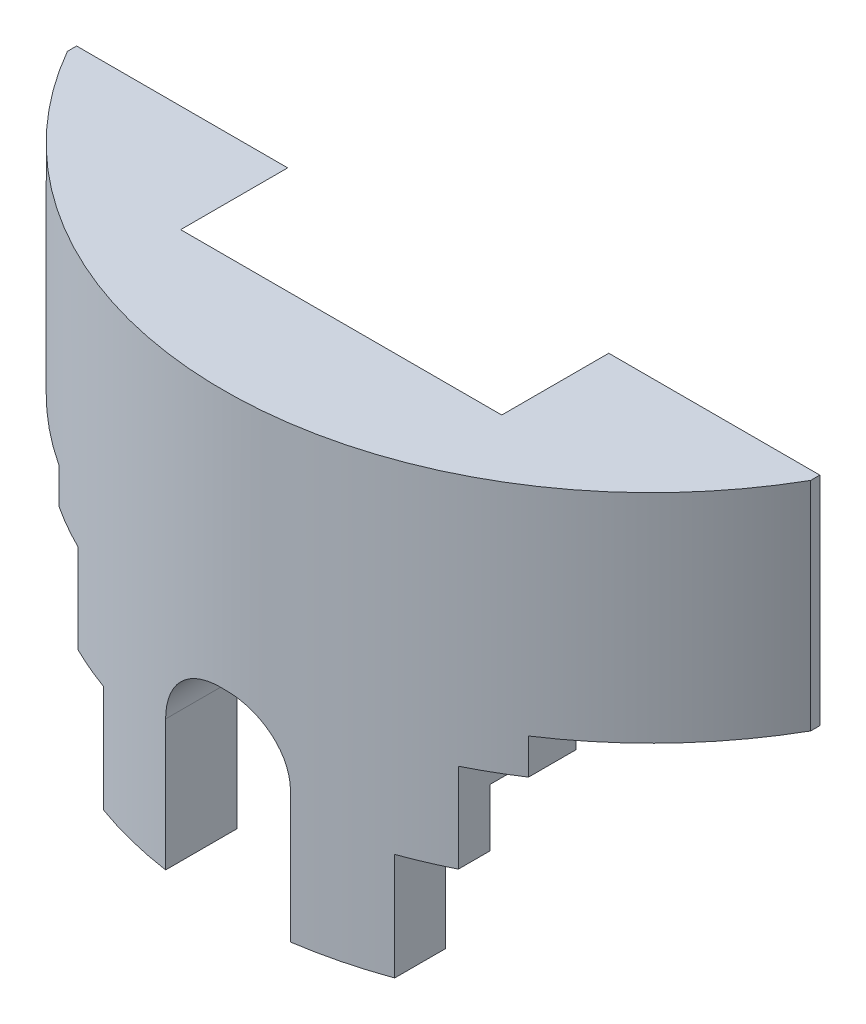
ISO-10303-21;
HEADER;
FILE_DESCRIPTION(('STEP AP214'),'2;1');
FILE_NAME('part.step','',(''),(''),'','','');
FILE_SCHEMA(('AUTOMOTIVE_DESIGN { 1 0 10303 214 1 1 1 1 }'));
ENDSEC;
DATA;
#1=APPLICATION_CONTEXT('core data for automotive mechanical design processes');
#2=APPLICATION_PROTOCOL_DEFINITION('international standard','automotive_design',2000,#1);
#3=PRODUCT_CONTEXT('',#1,'mechanical');
#4=PRODUCT('Part','Part','',(#3));
#5=PRODUCT_RELATED_PRODUCT_CATEGORY('part','',(#4));
#6=PRODUCT_DEFINITION_FORMATION('','',#4);
#7=PRODUCT_DEFINITION_CONTEXT('part definition',#1,'design');
#8=PRODUCT_DEFINITION('design','',#6,#7);
#9=PRODUCT_DEFINITION_SHAPE('','',#8);
#10=(LENGTH_UNIT() NAMED_UNIT(*) SI_UNIT(.MILLI.,.METRE.));
#11=(NAMED_UNIT(*) PLANE_ANGLE_UNIT() SI_UNIT($,.RADIAN.));
#12=(NAMED_UNIT(*) SI_UNIT($,.STERADIAN.) SOLID_ANGLE_UNIT());
#13=UNCERTAINTY_MEASURE_WITH_UNIT(LENGTH_MEASURE(1.E-05),#10,'distance_accuracy_value','');
#14=(GEOMETRIC_REPRESENTATION_CONTEXT(3) GLOBAL_UNCERTAINTY_ASSIGNED_CONTEXT((#13)) GLOBAL_UNIT_ASSIGNED_CONTEXT((#10,
#11,#12)) REPRESENTATION_CONTEXT('',''));
#15=CARTESIAN_POINT('',(0.,0.,0.));
#16=DIRECTION('',(0.,0.,1.));
#17=DIRECTION('',(1.,0.,0.));
#18=AXIS2_PLACEMENT_3D('',#15,#16,#17);
#19=CARTESIAN_POINT('',(0.,-42.5,0.));
#20=DIRECTION('',(0.,-1.,0.));
#21=DIRECTION('',(0.,0.,-1.));
#22=AXIS2_PLACEMENT_3D('',#19,#20,#21);
#23=PLANE('',#22);
#24=DIRECTION('',(1.,0.,0.));
#25=VECTOR('',#24,1.);
#26=CARTESIAN_POINT('',(0.,-42.5,52.2));
#27=LINE('',#26,#25);
#28=CARTESIAN_POINT('',(32.,-42.5,52.2));
#29=VERTEX_POINT('',#28);
#30=CARTESIAN_POINT('',(39.5,-42.5,52.2));
#31=VERTEX_POINT('',#30);
#32=EDGE_CURVE('E239',#29,#31,#27,.T.);
#33=ORIENTED_EDGE('',*,*,#32,.T.);
#34=DIRECTION('',(0.,0.,1.));
#35=VECTOR('',#34,1.);
#36=CARTESIAN_POINT('',(39.5,-42.5,0.));
#37=LINE('',#36,#35);
#38=CARTESIAN_POINT('',(39.5,-42.5,60.1975913139388));
#39=VERTEX_POINT('',#38);
#40=EDGE_CURVE('E289',#31,#39,#37,.T.);
#41=ORIENTED_EDGE('',*,*,#40,.T.);
#42=CARTESIAN_POINT('',(0.,-42.5,0.));
#43=DIRECTION('',(0.,-1.,0.));
#44=DIRECTION('',(0.,0.,-1.));
#45=AXIS2_PLACEMENT_3D('',#42,#43,#44);
#46=CIRCLE('',#45,72.);
#47=CARTESIAN_POINT('',(32.,-42.5,64.4980619863884));
#48=VERTEX_POINT('',#47);
#49=EDGE_CURVE('E293',#39,#48,#46,.T.);
#50=ORIENTED_EDGE('',*,*,#49,.T.);
#51=DIRECTION('',(0.,0.,1.));
#52=VECTOR('',#51,1.);
#53=CARTESIAN_POINT('',(32.,-42.5,34.2));
#54=LINE('',#53,#52);
#55=EDGE_CURVE('E282',#29,#48,#54,.T.);
#56=ORIENTED_EDGE('',*,*,#55,.F.);
#57=EDGE_LOOP('',(#33,#41,#50,#56));
#58=FACE_BOUND('',#57,.T.);
#59=ADVANCED_FACE('F36',(#58),#23,.T.);
#60=CARTESIAN_POINT('',(39.5,-42.5,0.));
#61=DIRECTION('',(-1.,0.,0.));
#62=DIRECTION('',(0.,0.,1.));
#63=AXIS2_PLACEMENT_3D('',#60,#61,#62);
#64=PLANE('',#63);
#65=ORIENTED_EDGE('',*,*,#40,.F.);
#66=DIRECTION('',(0.,-1.,0.));
#67=VECTOR('',#66,1.);
#68=CARTESIAN_POINT('',(39.5,-42.5,52.2));
#69=LINE('',#68,#67);
#70=CARTESIAN_POINT('',(39.5,-36.5,52.2));
#71=VERTEX_POINT('',#70);
#72=EDGE_CURVE('E440',#71,#31,#69,.T.);
#73=ORIENTED_EDGE('',*,*,#72,.F.);
#74=DIRECTION('',(0.,0.,1.));
#75=VECTOR('',#74,1.);
#76=CARTESIAN_POINT('',(39.5,-36.5,0.));
#77=LINE('',#76,#75);
#78=CARTESIAN_POINT('',(39.5,-36.5,60.1975913139388));
#79=VERTEX_POINT('',#78);
#80=EDGE_CURVE('E288',#71,#79,#77,.T.);
#81=ORIENTED_EDGE('',*,*,#80,.T.);
#82=DIRECTION('',(0.,1.,0.));
#83=VECTOR('',#82,1.);
#84=CARTESIAN_POINT('',(39.5,-42.5,60.1975913139388));
#85=LINE('',#84,#83);
#86=EDGE_CURVE('E305',#39,#79,#85,.T.);
#87=ORIENTED_EDGE('',*,*,#86,.F.);
#88=EDGE_LOOP('',(#65,#73,#81,#87));
#89=FACE_BOUND('',#88,.T.);
#90=ADVANCED_FACE('F411',(#89),#64,.F.);
#91=CARTESIAN_POINT('',(-39.5,-42.5,0.));
#92=DIRECTION('',(1.,0.,0.));
#93=DIRECTION('',(0.,0.,-1.));
#94=AXIS2_PLACEMENT_3D('',#91,#92,#93);
#95=PLANE('',#94);
#96=DIRECTION('',(0.,1.,0.));
#97=VECTOR('',#96,1.);
#98=CARTESIAN_POINT('',(-39.5,-42.5,52.2));
#99=LINE('',#98,#97);
#100=CARTESIAN_POINT('',(-39.5,-42.5,52.2));
#101=VERTEX_POINT('',#100);
#102=CARTESIAN_POINT('',(-39.5,-36.5,52.2));
#103=VERTEX_POINT('',#102);
#104=EDGE_CURVE('E436',#101,#103,#99,.T.);
#105=ORIENTED_EDGE('',*,*,#104,.F.);
#106=DIRECTION('',(0.,0.,-1.));
#107=VECTOR('',#106,1.);
#108=CARTESIAN_POINT('',(-39.5,-42.5,0.));
#109=LINE('',#108,#107);
#110=CARTESIAN_POINT('',(-39.5,-42.5,60.1975913139388));
#111=VERTEX_POINT('',#110);
#112=EDGE_CURVE('E296',#111,#101,#109,.T.);
#113=ORIENTED_EDGE('',*,*,#112,.F.);
#114=DIRECTION('',(0.,1.,0.));
#115=VECTOR('',#114,1.);
#116=CARTESIAN_POINT('',(-39.5,-42.5,60.1975913139388));
#117=LINE('',#116,#115);
#118=CARTESIAN_POINT('',(-39.5,-36.5,60.1975913139388));
#119=VERTEX_POINT('',#118);
#120=EDGE_CURVE('E299',#111,#119,#117,.T.);
#121=ORIENTED_EDGE('',*,*,#120,.T.);
#122=DIRECTION('',(0.,0.,-1.));
#123=VECTOR('',#122,1.);
#124=CARTESIAN_POINT('',(-39.5,-36.5,0.));
#125=LINE('',#124,#123);
#126=EDGE_CURVE('E292',#119,#103,#125,.T.);
#127=ORIENTED_EDGE('',*,*,#126,.T.);
#128=EDGE_LOOP('',(#105,#113,#121,#127));
#129=FACE_BOUND('',#128,.T.);
#130=ADVANCED_FACE('F418',(#129),#95,.F.);
#131=ORIENTED_EDGE('',*,*,#112,.T.);
#132=DIRECTION('',(1.,0.,0.));
#133=VECTOR('',#132,1.);
#134=CARTESIAN_POINT('',(0.,-42.5,52.2));
#135=LINE('',#134,#133);
#136=CARTESIAN_POINT('',(-32.,-42.5,52.2));
#137=VERTEX_POINT('',#136);
#138=EDGE_CURVE('E238',#101,#137,#135,.T.);
#139=ORIENTED_EDGE('',*,*,#138,.T.);
#140=DIRECTION('',(0.,0.,-1.));
#141=VECTOR('',#140,1.);
#142=CARTESIAN_POINT('',(-32.,-42.5,64.4980619863884));
#143=LINE('',#142,#141);
#144=CARTESIAN_POINT('',(-32.,-42.5,64.4980619863884));
#145=VERTEX_POINT('',#144);
#146=EDGE_CURVE('E237',#145,#137,#143,.T.);
#147=ORIENTED_EDGE('',*,*,#146,.F.);
#148=EDGE_CURVE('E291',#145,#111,#46,.T.);
#149=ORIENTED_EDGE('',*,*,#148,.T.);
#150=EDGE_LOOP('',(#131,#139,#147,#149));
#151=FACE_BOUND('',#150,.T.);
#152=ADVANCED_FACE('F414',(#151),#23,.T.);
#153=CARTESIAN_POINT('',(-32.,-57.5,64.4980619863884));
#154=DIRECTION('',(1.,0.,0.));
#155=DIRECTION('',(0.,0.,-1.));
#156=AXIS2_PLACEMENT_3D('',#153,#154,#155);
#157=PLANE('',#156);
#158=DIRECTION('',(0.,1.,0.));
#159=VECTOR('',#158,1.);
#160=CARTESIAN_POINT('',(-32.,-57.5,52.2));
#161=LINE('',#160,#159);
#162=CARTESIAN_POINT('',(-32.,-47.8210916541997,52.2));
#163=VERTEX_POINT('',#162);
#164=EDGE_CURVE('E223',#163,#137,#161,.T.);
#165=ORIENTED_EDGE('',*,*,#164,.F.);
#166=DIRECTION('',(0.,0.,-1.));
#167=VECTOR('',#166,1.);
#168=CARTESIAN_POINT('',(-32.,-47.8210916541997,59.2));
#169=LINE('',#168,#167);
#170=CARTESIAN_POINT('',(-32.,-47.8210916541997,59.2));
#171=VERTEX_POINT('',#170);
#172=EDGE_CURVE('E234',#163,#171,#169,.F.);
#173=ORIENTED_EDGE('',*,*,#172,.T.);
#174=DIRECTION('',(0.,1.,0.));
#175=VECTOR('',#174,1.);
#176=CARTESIAN_POINT('',(-32.,-57.5,59.2));
#177=LINE('',#176,#175);
#178=CARTESIAN_POINT('',(-32.,-57.5,59.2));
#179=VERTEX_POINT('',#178);
#180=EDGE_CURVE('E246',#179,#171,#177,.T.);
#181=ORIENTED_EDGE('',*,*,#180,.F.);
#182=DIRECTION('',(0.,0.,-1.));
#183=VECTOR('',#182,1.);
#184=CARTESIAN_POINT('',(-32.,-57.5,64.4980619863884));
#185=LINE('',#184,#183);
#186=CARTESIAN_POINT('',(-32.,-57.5,64.4980619863884));
#187=VERTEX_POINT('',#186);
#188=EDGE_CURVE('E274',#187,#179,#185,.T.);
#189=ORIENTED_EDGE('',*,*,#188,.F.);
#190=DIRECTION('',(0.,1.,0.));
#191=VECTOR('',#190,1.);
#192=CARTESIAN_POINT('',(-32.,-57.5,64.4980619863884));
#193=LINE('',#192,#191);
#194=EDGE_CURVE('E286',#187,#145,#193,.T.);
#195=ORIENTED_EDGE('',*,*,#194,.T.);
#196=ORIENTED_EDGE('',*,*,#146,.T.);
#197=EDGE_LOOP('',(#165,#173,#181,#189,#195,#196));
#198=FACE_BOUND('',#197,.T.);
#199=ADVANCED_FACE('F232',(#198),#157,.F.);
#200=CARTESIAN_POINT('',(32.,-57.5,34.2));
#201=DIRECTION('',(-1.,0.,0.));
#202=DIRECTION('',(0.,0.,1.));
#203=AXIS2_PLACEMENT_3D('',#200,#201,#202);
#204=PLANE('',#203);
#205=DIRECTION('',(0.,0.,-1.));
#206=VECTOR('',#205,1.);
#207=CARTESIAN_POINT('',(32.,-47.8210916541997,59.2));
#208=LINE('',#207,#206);
#209=CARTESIAN_POINT('',(32.,-47.8210916541997,59.2));
#210=VERTEX_POINT('',#209);
#211=CARTESIAN_POINT('',(32.,-47.8210916541997,52.2));
#212=VERTEX_POINT('',#211);
#213=EDGE_CURVE('E348',#210,#212,#208,.T.);
#214=ORIENTED_EDGE('',*,*,#213,.T.);
#215=DIRECTION('',(0.,-1.,0.));
#216=VECTOR('',#215,1.);
#217=CARTESIAN_POINT('',(32.,-57.5,52.2));
#218=LINE('',#217,#216);
#219=EDGE_CURVE('E226',#29,#212,#218,.T.);
#220=ORIENTED_EDGE('',*,*,#219,.F.);
#221=ORIENTED_EDGE('',*,*,#55,.T.);
#222=DIRECTION('',(0.,1.,0.));
#223=VECTOR('',#222,1.);
#224=CARTESIAN_POINT('',(32.,-57.5,64.4980619863884));
#225=LINE('',#224,#223);
#226=CARTESIAN_POINT('',(32.,-57.5,64.4980619863884));
#227=VERTEX_POINT('',#226);
#228=EDGE_CURVE('E280',#227,#48,#225,.T.);
#229=ORIENTED_EDGE('',*,*,#228,.F.);
#230=DIRECTION('',(0.,0.,1.));
#231=VECTOR('',#230,1.);
#232=CARTESIAN_POINT('',(32.,-57.5,34.2));
#233=LINE('',#232,#231);
#234=CARTESIAN_POINT('',(32.,-57.5,59.2));
#235=VERTEX_POINT('',#234);
#236=EDGE_CURVE('E278',#235,#227,#233,.T.);
#237=ORIENTED_EDGE('',*,*,#236,.F.);
#238=DIRECTION('',(0.,-1.,0.));
#239=VECTOR('',#238,1.);
#240=CARTESIAN_POINT('',(32.,-57.5,59.2));
#241=LINE('',#240,#239);
#242=EDGE_CURVE('E472',#210,#235,#241,.T.);
#243=ORIENTED_EDGE('',*,*,#242,.F.);
#244=EDGE_LOOP('',(#214,#220,#221,#229,#237,#243));
#245=FACE_BOUND('',#244,.T.);
#246=ADVANCED_FACE('F430',(#245),#204,.F.);
#247=CARTESIAN_POINT('',(0.,-53.5,59.2));
#248=DIRECTION('',(0.,0.,-1.));
#249=DIRECTION('',(-1.,0.,0.));
#250=AXIS2_PLACEMENT_3D('',#247,#248,#249);
#251=CYLINDRICAL_SURFACE('',#250,32.5);
#252=CARTESIAN_POINT('',(0.,-53.5,52.2));
#253=DIRECTION('',(0.,0.,-1.));
#254=DIRECTION('',(-1.,0.,0.));
#255=AXIS2_PLACEMENT_3D('',#252,#253,#254);
#256=CIRCLE('',#255,32.5);
#257=EDGE_CURVE('E12',#212,#163,#256,.F.);
#258=ORIENTED_EDGE('',*,*,#257,.F.);
#259=ORIENTED_EDGE('',*,*,#213,.F.);
#260=CARTESIAN_POINT('',(0.,-53.5,59.2));
#261=DIRECTION('',(0.,0.,-1.));
#262=DIRECTION('',(-1.,0.,0.));
#263=AXIS2_PLACEMENT_3D('',#260,#261,#262);
#264=CIRCLE('',#263,32.5);
#265=EDGE_CURVE('E244',#171,#210,#264,.T.);
#266=ORIENTED_EDGE('',*,*,#265,.F.);
#267=ORIENTED_EDGE('',*,*,#172,.F.);
#268=EDGE_LOOP('',(#258,#259,#266,#267));
#269=FACE_BOUND('',#268,.T.);
#270=ADVANCED_FACE('F242',(#269),#251,.F.);
#271=CARTESIAN_POINT('',(-62.5,-36.5,34.2));
#272=DIRECTION('',(0.,0.,-1.));
#273=DIRECTION('',(-1.,0.,0.));
#274=AXIS2_PLACEMENT_3D('',#271,#272,#273);
#275=PLANE('',#274);
#276=CARTESIAN_POINT('',(27.,-22.,34.2));
#277=DIRECTION('',(0.,0.,-1.));
#278=DIRECTION('',(-1.,0.,0.));
#279=AXIS2_PLACEMENT_3D('',#276,#277,#278);
#280=CIRCLE('',#279,22.);
#281=CARTESIAN_POINT('',(27.,0.,34.2));
#282=VERTEX_POINT('',#281);
#283=CARTESIAN_POINT('',(43.5453921077743,-36.5,34.2));
#284=VERTEX_POINT('',#283);
#285=EDGE_CURVE('E803',#282,#284,#280,.T.);
#286=ORIENTED_EDGE('',*,*,#285,.F.);
#287=DIRECTION('',(-1.,0.,0.));
#288=VECTOR('',#287,1.);
#289=CARTESIAN_POINT('',(-62.5,0.,34.2));
#290=LINE('',#289,#288);
#291=CARTESIAN_POINT('',(62.5,0.,34.2));
#292=VERTEX_POINT('',#291);
#293=EDGE_CURVE('E324',#292,#282,#290,.T.);
#294=ORIENTED_EDGE('',*,*,#293,.F.);
#295=DIRECTION('',(0.,1.,0.));
#296=VECTOR('',#295,1.);
#297=CARTESIAN_POINT('',(62.5,-36.5,34.2));
#298=LINE('',#297,#296);
#299=CARTESIAN_POINT('',(62.5,-36.5,34.2));
#300=VERTEX_POINT('',#299);
#301=EDGE_CURVE('E336',#300,#292,#298,.T.);
#302=ORIENTED_EDGE('',*,*,#301,.F.);
#303=DIRECTION('',(-1.,0.,0.));
#304=VECTOR('',#303,1.);
#305=CARTESIAN_POINT('',(-62.5,-36.5,34.2));
#306=LINE('',#305,#304);
#307=EDGE_CURVE('E309',#300,#284,#306,.T.);
#308=ORIENTED_EDGE('',*,*,#307,.T.);
#309=EDGE_LOOP('',(#286,#294,#302,#308));
#310=FACE_BOUND('',#309,.T.);
#311=ADVANCED_FACE('F397',(#310),#275,.T.);
#312=CARTESIAN_POINT('',(0.,-75.5,0.));
#313=DIRECTION('',(0.,1.,0.));
#314=DIRECTION('',(0.,0.,1.));
#315=AXIS2_PLACEMENT_3D('',#312,#313,#314);
#316=PLANE('',#315);
#317=DIRECTION('',(-1.,0.,0.));
#318=VECTOR('',#317,1.);
#319=CARTESIAN_POINT('',(0.,-75.5,59.2));
#320=LINE('',#319,#318);
#321=CARTESIAN_POINT('',(-10.5,-75.5,59.2));
#322=VERTEX_POINT('',#321);
#323=CARTESIAN_POINT('',(-24.5,-75.5,59.2));
#324=VERTEX_POINT('',#323);
#325=EDGE_CURVE('E338',#322,#324,#320,.T.);
#326=ORIENTED_EDGE('',*,*,#325,.F.);
#327=DIRECTION('',(0.,0.,-1.));
#328=VECTOR('',#327,1.);
#329=CARTESIAN_POINT('',(-10.5,-75.5,34.2));
#330=LINE('',#329,#328);
#331=CARTESIAN_POINT('',(-10.5,-75.5,71.2302604235026));
#332=VERTEX_POINT('',#331);
#333=EDGE_CURVE('E453',#332,#322,#330,.T.);
#334=ORIENTED_EDGE('',*,*,#333,.F.);
#335=CARTESIAN_POINT('',(0.,-75.5,0.));
#336=DIRECTION('',(0.,-1.,0.));
#337=DIRECTION('',(0.,0.,1.));
#338=AXIS2_PLACEMENT_3D('',#335,#336,#337);
#339=CIRCLE('',#338,72.);
#340=CARTESIAN_POINT('',(-24.5,-75.5,67.7033972559723));
#341=VERTEX_POINT('',#340);
#342=EDGE_CURVE('E256',#332,#341,#339,.T.);
#343=ORIENTED_EDGE('',*,*,#342,.T.);
#344=DIRECTION('',(0.,0.,-1.));
#345=VECTOR('',#344,1.);
#346=CARTESIAN_POINT('',(-24.5,-75.5,34.2));
#347=LINE('',#346,#345);
#348=EDGE_CURVE('E260',#341,#324,#347,.T.);
#349=ORIENTED_EDGE('',*,*,#348,.T.);
#350=EDGE_LOOP('',(#326,#334,#343,#349));
#351=FACE_BOUND('',#350,.T.);
#352=ADVANCED_FACE('F408',(#351),#316,.F.);
#353=CARTESIAN_POINT('',(0.,-57.5,0.));
#354=DIRECTION('',(0.,-1.,0.));
#355=DIRECTION('',(0.,0.,-1.));
#356=AXIS2_PLACEMENT_3D('',#353,#354,#355);
#357=PLANE('',#356);
#358=ORIENTED_EDGE('',*,*,#188,.T.);
#359=DIRECTION('',(1.,0.,0.));
#360=VECTOR('',#359,1.);
#361=CARTESIAN_POINT('',(0.,-57.5,59.2));
#362=LINE('',#361,#360);
#363=CARTESIAN_POINT('',(-24.5,-57.5,59.2));
#364=VERTEX_POINT('',#363);
#365=EDGE_CURVE('E250',#179,#364,#362,.T.);
#366=ORIENTED_EDGE('',*,*,#365,.T.);
#367=DIRECTION('',(0.,0.,-1.));
#368=VECTOR('',#367,1.);
#369=CARTESIAN_POINT('',(-24.5,-57.5,34.2));
#370=LINE('',#369,#368);
#371=CARTESIAN_POINT('',(-24.5,-57.5,67.7033972559723));
#372=VERTEX_POINT('',#371);
#373=EDGE_CURVE('E248',#372,#364,#370,.T.);
#374=ORIENTED_EDGE('',*,*,#373,.F.);
#375=CARTESIAN_POINT('',(0.,-57.5,0.));
#376=DIRECTION('',(0.,-1.,0.));
#377=DIRECTION('',(0.,0.,-1.));
#378=AXIS2_PLACEMENT_3D('',#375,#376,#377);
#379=CIRCLE('',#378,72.);
#380=EDGE_CURVE('E275',#372,#187,#379,.T.);
#381=ORIENTED_EDGE('',*,*,#380,.T.);
#382=EDGE_LOOP('',(#358,#366,#374,#381));
#383=FACE_BOUND('',#382,.T.);
#384=ADVANCED_FACE('F475',(#383),#357,.T.);
#385=DIRECTION('',(0.,0.,1.));
#386=VECTOR('',#385,1.);
#387=CARTESIAN_POINT('',(24.5,-57.5,34.2));
#388=LINE('',#387,#386);
#389=CARTESIAN_POINT('',(24.5,-57.5,59.2));
#390=VERTEX_POINT('',#389);
#391=CARTESIAN_POINT('',(24.5,-57.5,67.7033972559723));
#392=VERTEX_POINT('',#391);
#393=EDGE_CURVE('E245',#390,#392,#388,.T.);
#394=ORIENTED_EDGE('',*,*,#393,.F.);
#395=DIRECTION('',(1.,0.,0.));
#396=VECTOR('',#395,1.);
#397=CARTESIAN_POINT('',(0.,-57.5,59.2));
#398=LINE('',#397,#396);
#399=EDGE_CURVE('E469',#390,#235,#398,.T.);
#400=ORIENTED_EDGE('',*,*,#399,.T.);
#401=ORIENTED_EDGE('',*,*,#236,.T.);
#402=EDGE_CURVE('E271',#227,#392,#379,.T.);
#403=ORIENTED_EDGE('',*,*,#402,.T.);
#404=EDGE_LOOP('',(#394,#400,#401,#403));
#405=FACE_BOUND('',#404,.T.);
#406=ADVANCED_FACE('F496',(#405),#357,.T.);
#407=CARTESIAN_POINT('',(24.5,-75.5,34.2));
#408=DIRECTION('',(-1.,0.,0.));
#409=DIRECTION('',(0.,0.,1.));
#410=AXIS2_PLACEMENT_3D('',#407,#408,#409);
#411=PLANE('',#410);
#412=DIRECTION('',(0.,-1.,0.));
#413=VECTOR('',#412,1.);
#414=CARTESIAN_POINT('',(24.5,-75.5,59.2));
#415=LINE('',#414,#413);
#416=CARTESIAN_POINT('',(24.5,-75.5,59.2));
#417=VERTEX_POINT('',#416);
#418=EDGE_CURVE('E467',#390,#417,#415,.T.);
#419=ORIENTED_EDGE('',*,*,#418,.F.);
#420=ORIENTED_EDGE('',*,*,#393,.T.);
#421=DIRECTION('',(0.,1.,0.));
#422=VECTOR('',#421,1.);
#423=CARTESIAN_POINT('',(24.5,-75.5,67.7033972559723));
#424=LINE('',#423,#422);
#425=CARTESIAN_POINT('',(24.5,-75.5,67.7033972559723));
#426=VERTEX_POINT('',#425);
#427=EDGE_CURVE('E268',#426,#392,#424,.T.);
#428=ORIENTED_EDGE('',*,*,#427,.F.);
#429=DIRECTION('',(0.,0.,1.));
#430=VECTOR('',#429,1.);
#431=CARTESIAN_POINT('',(24.5,-75.5,34.2));
#432=LINE('',#431,#430);
#433=EDGE_CURVE('E254',#417,#426,#432,.T.);
#434=ORIENTED_EDGE('',*,*,#433,.F.);
#435=EDGE_LOOP('',(#419,#420,#428,#434));
#436=FACE_BOUND('',#435,.T.);
#437=ADVANCED_FACE('F501',(#436),#411,.F.);
#438=CARTESIAN_POINT('',(-24.5,-75.5,34.2));
#439=DIRECTION('',(1.,0.,0.));
#440=DIRECTION('',(0.,0.,-1.));
#441=AXIS2_PLACEMENT_3D('',#438,#439,#440);
#442=PLANE('',#441);
#443=DIRECTION('',(0.,1.,0.));
#444=VECTOR('',#443,1.);
#445=CARTESIAN_POINT('',(-24.5,-75.5,59.2));
#446=LINE('',#445,#444);
#447=EDGE_CURVE('E465',#324,#364,#446,.T.);
#448=ORIENTED_EDGE('',*,*,#447,.F.);
#449=ORIENTED_EDGE('',*,*,#348,.F.);
#450=DIRECTION('',(0.,1.,0.));
#451=VECTOR('',#450,1.);
#452=CARTESIAN_POINT('',(-24.5,-75.5,67.7033972559723));
#453=LINE('',#452,#451);
#454=EDGE_CURVE('E262',#341,#372,#453,.T.);
#455=ORIENTED_EDGE('',*,*,#454,.T.);
#456=ORIENTED_EDGE('',*,*,#373,.T.);
#457=EDGE_LOOP('',(#448,#449,#455,#456));
#458=FACE_BOUND('',#457,.T.);
#459=ADVANCED_FACE('F481',(#458),#442,.F.);
#460=CARTESIAN_POINT('',(10.5,-75.5,71.2302604235026));
#461=VERTEX_POINT('',#460);
#462=EDGE_CURVE('E257',#426,#461,#339,.T.);
#463=ORIENTED_EDGE('',*,*,#462,.T.);
#464=DIRECTION('',(0.,0.,1.));
#465=VECTOR('',#464,1.);
#466=CARTESIAN_POINT('',(10.5,-75.5,34.2));
#467=LINE('',#466,#465);
#468=CARTESIAN_POINT('',(10.5,-75.5,59.2));
#469=VERTEX_POINT('',#468);
#470=EDGE_CURVE('E455',#469,#461,#467,.T.);
#471=ORIENTED_EDGE('',*,*,#470,.F.);
#472=EDGE_CURVE('E345',#417,#469,#320,.T.);
#473=ORIENTED_EDGE('',*,*,#472,.F.);
#474=ORIENTED_EDGE('',*,*,#433,.T.);
#475=EDGE_LOOP('',(#463,#471,#473,#474));
#476=FACE_BOUND('',#475,.T.);
#477=ADVANCED_FACE('F505',(#476),#316,.F.);
#478=CARTESIAN_POINT('',(0.,-36.5,0.));
#479=DIRECTION('',(0.,1.,0.));
#480=DIRECTION('',(0.,0.,1.));
#481=AXIS2_PLACEMENT_3D('',#478,#479,#480);
#482=PLANE('',#481);
#483=CARTESIAN_POINT('',(-43.5453921077743,-36.5,34.2));
#484=VERTEX_POINT('',#483);
#485=CARTESIAN_POINT('',(-62.5,-36.5,34.2));
#486=VERTEX_POINT('',#485);
#487=EDGE_CURVE('E313',#484,#486,#306,.T.);
#488=ORIENTED_EDGE('',*,*,#487,.F.);
#489=DIRECTION('',(0.,0.,-1.));
#490=VECTOR('',#489,1.);
#491=CARTESIAN_POINT('',(-43.5453921077743,-36.5,52.2));
#492=LINE('',#491,#490);
#493=CARTESIAN_POINT('',(-43.5453921077743,-36.5,52.2));
#494=VERTEX_POINT('',#493);
#495=EDGE_CURVE('E447',#484,#494,#492,.F.);
#496=ORIENTED_EDGE('',*,*,#495,.T.);
#497=DIRECTION('',(-1.,0.,0.));
#498=VECTOR('',#497,1.);
#499=CARTESIAN_POINT('',(0.,-36.5,52.2));
#500=LINE('',#499,#498);
#501=EDGE_CURVE('E438',#103,#494,#500,.T.);
#502=ORIENTED_EDGE('',*,*,#501,.F.);
#503=ORIENTED_EDGE('',*,*,#126,.F.);
#504=CARTESIAN_POINT('',(0.,-36.5,0.));
#505=DIRECTION('',(0.,1.,0.));
#506=DIRECTION('',(0.,0.,1.));
#507=AXIS2_PLACEMENT_3D('',#504,#505,#506);
#508=CIRCLE('',#507,72.);
#509=CARTESIAN_POINT('',(-62.5,-36.5,35.7456291034303));
#510=VERTEX_POINT('',#509);
#511=EDGE_CURVE('E317',#510,#119,#508,.T.);
#512=ORIENTED_EDGE('',*,*,#511,.F.);
#513=DIRECTION('',(0.,0.,1.));
#514=VECTOR('',#513,1.);
#515=CARTESIAN_POINT('',(-62.5,-36.5,34.2));
#516=LINE('',#515,#514);
#517=EDGE_CURVE('E312',#486,#510,#516,.T.);
#518=ORIENTED_EDGE('',*,*,#517,.F.);
#519=EDGE_LOOP('',(#488,#496,#502,#503,#512,#518));
#520=FACE_BOUND('',#519,.T.);
#521=ADVANCED_FACE('F403',(#520),#482,.F.);
#522=DIRECTION('',(-1.,0.,0.));
#523=VECTOR('',#522,1.);
#524=CARTESIAN_POINT('',(0.,-36.5,52.2));
#525=LINE('',#524,#523);
#526=CARTESIAN_POINT('',(43.5453921077743,-36.5,52.2));
#527=VERTEX_POINT('',#526);
#528=EDGE_CURVE('E445',#527,#71,#525,.T.);
#529=ORIENTED_EDGE('',*,*,#528,.F.);
#530=DIRECTION('',(0.,0.,-1.));
#531=VECTOR('',#530,1.);
#532=CARTESIAN_POINT('',(43.5453921077743,-36.5,52.2));
#533=LINE('',#532,#531);
#534=EDGE_CURVE('E450',#527,#284,#533,.T.);
#535=ORIENTED_EDGE('',*,*,#534,.T.);
#536=ORIENTED_EDGE('',*,*,#307,.F.);
#537=DIRECTION('',(0.,0.,-1.));
#538=VECTOR('',#537,1.);
#539=CARTESIAN_POINT('',(62.5,-36.5,34.2));
#540=LINE('',#539,#538);
#541=CARTESIAN_POINT('',(62.5,-36.5,35.7456291034302));
#542=VERTEX_POINT('',#541);
#543=EDGE_CURVE('E320',#542,#300,#540,.T.);
#544=ORIENTED_EDGE('',*,*,#543,.F.);
#545=EDGE_CURVE('E316',#79,#542,#508,.T.);
#546=ORIENTED_EDGE('',*,*,#545,.F.);
#547=ORIENTED_EDGE('',*,*,#80,.F.);
#548=EDGE_LOOP('',(#529,#535,#536,#544,#546,#547));
#549=FACE_BOUND('',#548,.T.);
#550=ADVANCED_FACE('F395',(#549),#482,.F.);
#551=CARTESIAN_POINT('',(-27.,-22.,34.2));
#552=DIRECTION('',(0.,0.,-1.));
#553=DIRECTION('',(-1.,0.,0.));
#554=AXIS2_PLACEMENT_3D('',#551,#552,#553);
#555=CIRCLE('',#554,22.);
#556=CARTESIAN_POINT('',(-27.,0.,34.2));
#557=VERTEX_POINT('',#556);
#558=EDGE_CURVE('E787',#484,#557,#555,.T.);
#559=ORIENTED_EDGE('',*,*,#558,.F.);
#560=ORIENTED_EDGE('',*,*,#487,.T.);
#561=DIRECTION('',(0.,1.,0.));
#562=VECTOR('',#561,1.);
#563=CARTESIAN_POINT('',(-62.5,-36.5,34.2));
#564=LINE('',#563,#562);
#565=CARTESIAN_POINT('',(-62.5,0.,34.2));
#566=VERTEX_POINT('',#565);
#567=EDGE_CURVE('E323',#486,#566,#564,.T.);
#568=ORIENTED_EDGE('',*,*,#567,.T.);
#569=EDGE_CURVE('E308',#557,#566,#290,.T.);
#570=ORIENTED_EDGE('',*,*,#569,.F.);
#571=EDGE_LOOP('',(#559,#560,#568,#570));
#572=FACE_BOUND('',#571,.T.);
#573=ADVANCED_FACE('F393',(#572),#275,.T.);
#574=CARTESIAN_POINT('',(62.5,-36.5,34.2));
#575=DIRECTION('',(1.,0.,0.));
#576=DIRECTION('',(0.,0.,-1.));
#577=AXIS2_PLACEMENT_3D('',#574,#575,#576);
#578=PLANE('',#577);
#579=DIRECTION('',(0.,0.,-1.));
#580=VECTOR('',#579,1.);
#581=CARTESIAN_POINT('',(62.5,0.,34.2));
#582=LINE('',#581,#580);
#583=CARTESIAN_POINT('',(62.5,0.,35.7456291034302));
#584=VERTEX_POINT('',#583);
#585=EDGE_CURVE('E333',#584,#292,#582,.T.);
#586=ORIENTED_EDGE('',*,*,#585,.F.);
#587=DIRECTION('',(0.,1.,0.));
#588=VECTOR('',#587,1.);
#589=CARTESIAN_POINT('',(62.5,-36.5,35.7456291034302));
#590=LINE('',#589,#588);
#591=EDGE_CURVE('E339',#542,#584,#590,.T.);
#592=ORIENTED_EDGE('',*,*,#591,.F.);
#593=ORIENTED_EDGE('',*,*,#543,.T.);
#594=ORIENTED_EDGE('',*,*,#301,.T.);
#595=EDGE_LOOP('',(#586,#592,#593,#594));
#596=FACE_BOUND('',#595,.T.);
#597=ADVANCED_FACE('F387',(#596),#578,.T.);
#598=CARTESIAN_POINT('',(0.,-36.5,0.));
#599=DIRECTION('',(0.,1.,0.));
#600=DIRECTION('',(0.,0.,1.));
#601=AXIS2_PLACEMENT_3D('',#598,#599,#600);
#602=CYLINDRICAL_SURFACE('',#601,72.);
#603=DIRECTION('',(0.,1.,0.));
#604=VECTOR('',#603,1.);
#605=CARTESIAN_POINT('',(-10.5,-36.5,71.2302604235026));
#606=LINE('',#605,#604);
#607=CARTESIAN_POINT('',(-10.5,-53.5,71.2302604235026));
#608=VERTEX_POINT('',#607);
#609=EDGE_CURVE('E462',#608,#332,#606,.F.);
#610=ORIENTED_EDGE('',*,*,#609,.F.);
#611=CARTESIAN_POINT('',(-10.5,-53.5,71.2302604235026));
#612=CARTESIAN_POINT('',(-10.5000318896068,-53.2203562502942,71.2302432221756));
#613=CARTESIAN_POINT('',(-10.4882712756268,-52.9407190356558,71.2319889612127));
#614=CARTESIAN_POINT('',(-10.4413968735752,-52.3834744441433,71.2388817151814));
#615=CARTESIAN_POINT('',(-10.4062851157693,-52.1058668929214,71.2440284344145));
#616=CARTESIAN_POINT('',(-10.3129957328335,-51.5549771039073,71.2575905087987));
#617=CARTESIAN_POINT('',(-10.2548456097689,-51.2816901114853,71.2660019664235));
#618=CARTESIAN_POINT('',(-10.1159263531867,-50.7410422084241,71.2858540357494));
#619=CARTESIAN_POINT('',(-10.035157308626,-50.4736812744832,71.2972946355373));
#620=CARTESIAN_POINT('',(-9.85157117391986,-49.9466920465393,71.322893382333));
#621=CARTESIAN_POINT('',(-9.74874799461759,-49.6870659107104,71.3370522797507));
#622=CARTESIAN_POINT('',(-9.52181553738207,-49.1774249950024,71.3676966993025));
#623=CARTESIAN_POINT('',(-9.39770564526705,-48.9274104927009,71.3841822885659));
#624=CARTESIAN_POINT('',(-9.1290984342827,-48.4387357219678,71.4190303174495));
#625=CARTESIAN_POINT('',(-8.98460191016969,-48.2000750114026,71.4373926838974));
#626=CARTESIAN_POINT('',(-8.6762393650125,-47.7357319315694,71.4754992658996));
#627=CARTESIAN_POINT('',(-8.51237333344282,-47.5100495693539,71.4952434822047));
#628=CARTESIAN_POINT('',(-8.16527171992235,-47.0717601864053,71.5357187485123));
#629=CARTESIAN_POINT('',(-7.98191562533108,-46.8592491179221,71.5564554436065));
#630=CARTESIAN_POINT('',(-7.59801232523807,-46.4504002307535,71.5982365684368));
#631=CARTESIAN_POINT('',(-7.39746504846413,-46.2540624791271,71.6192809994484));
#632=CARTESIAN_POINT('',(-6.98052578952238,-45.8788812842905,71.6611202407874));
#633=CARTESIAN_POINT('',(-6.76413061363192,-45.7000413843637,71.6819149998117));
#634=CARTESIAN_POINT('',(-6.31702918332705,-45.3611513214773,71.7226987975393));
#635=CARTESIAN_POINT('',(-6.08632311907676,-45.2011009089234,71.742687846943));
#636=CARTESIAN_POINT('',(-5.61094837467386,-44.9001303575886,71.7814350070208));
#637=CARTESIAN_POINT('',(-5.36621293796585,-44.7593147246447,71.8001861278204));
#638=CARTESIAN_POINT('',(-4.86561400473583,-44.4988316151596,71.8358459721319));
#639=CARTESIAN_POINT('',(-4.60975070369934,-44.3791637672976,71.8527547279906));
#640=CARTESIAN_POINT('',(-4.08881830781539,-44.1619078993171,71.8842791123103));
#641=CARTESIAN_POINT('',(-3.82375393657339,-44.0643087375295,71.8988958967556));
#642=CARTESIAN_POINT('',(-3.28630588925391,-43.8918689333685,71.9254659104105));
#643=CARTESIAN_POINT('',(-3.01392400046756,-43.8170227876363,71.9374197835213));
#644=CARTESIAN_POINT('',(-2.37192200978974,-43.669568979104,71.9618536471884));
#645=CARTESIAN_POINT('',(-2.00011779527075,-43.6060014291924,71.9731839835814));
#646=CARTESIAN_POINT('',(-1.43918488788613,-43.5424209501828,71.9858586131107));
#647=CARTESIAN_POINT('',(-1.25175569149256,-43.526522617226,71.9893627292551));
#648=CARTESIAN_POINT('',(-0.87623592165015,-43.5053118458653,71.9949129806392));
#649=CARTESIAN_POINT('',(-0.688145210481235,-43.5000017607252,71.9969587917021));
#650=CARTESIAN_POINT('',(-0.500000000000001,-43.5,71.9982638679572));
#651=B_SPLINE_CURVE_WITH_KNOTS('',3,(#611,#612,#613,#614,#615,#616,#617,#618,#619,#620,#621,
#622,#623,#624,#625,#626,#627,#628,#629,#630,#631,#632,#633,#634,#635,#636,#637,#638,#639,#640,
#641,#642,#643,#644,#645,#646,#647,#648,#649,#650),.UNSPECIFIED.,.F.,.F.,(4,2,2,2,2,2,2,2,2,2,2,
2,2,2,2,2,2,2,2,4),(0.,0.838668984149888,1.67726505973973,2.51486306250061,3.352457771161,
4.19028403848825,5.02813448353722,5.86595227468688,6.70377052111404,7.54710919596734,
8.39045136735239,9.23396396208348,10.0774653505585,10.9253813594243,11.7732824787841,
12.6207545634395,13.4680215033949,14.5973483535101,15.1614974988911,15.7257720138311),.UNSPECIFIED.);
#652=CARTESIAN_POINT('',(-0.5,-43.5,71.9982638679572));
#653=VERTEX_POINT('',#652);
#654=EDGE_CURVE('E369',#608,#653,#651,.T.);
#655=ORIENTED_EDGE('',*,*,#654,.T.);
#656=CARTESIAN_POINT('',(0.,-43.5,0.));
#657=DIRECTION('',(0.,1.,0.));
#658=DIRECTION('',(0.,0.,1.));
#659=AXIS2_PLACEMENT_3D('',#656,#657,#658);
#660=CIRCLE('',#659,72.);
#661=CARTESIAN_POINT('',(0.5,-43.5,71.9982638679572));
#662=VERTEX_POINT('',#661);
#663=EDGE_CURVE('E457',#662,#653,#660,.F.);
#664=ORIENTED_EDGE('',*,*,#663,.F.);
#665=CARTESIAN_POINT('',(0.5,-43.5,71.9982638679572));
#666=CARTESIAN_POINT('',(0.78000762336906,-43.4999683184682,71.9963356849737));
#667=CARTESIAN_POINT('',(1.05999686224921,-43.5117592701079,71.9927419325381));
#668=CARTESIAN_POINT('',(1.6179208917887,-43.5587502185692,71.9823557636049));
#669=CARTESIAN_POINT('',(1.89585585855376,-43.5939481846911,71.9755636246015));
#670=CARTESIAN_POINT('',(2.44738274096362,-43.6874627262184,71.9589224382079));
#671=CARTESIAN_POINT('',(2.72097932219829,-43.7457524263869,71.9490769473335));
#672=CARTESIAN_POINT('',(3.26222035854874,-43.8850007905836,71.9265683912101));
#673=CARTESIAN_POINT('',(3.52986483529543,-43.9659593722147,71.9139053362026));
#674=CARTESIAN_POINT('',(4.05739469162397,-44.1499729533355,71.8860720382307));
#675=CARTESIAN_POINT('',(4.31727789362795,-44.2530340889937,71.8709010992897));
#676=CARTESIAN_POINT('',(4.82740413965042,-44.4804896614158,71.8384402481452));
#677=CARTESIAN_POINT('',(5.07764691072875,-44.6048847016428,71.8211502760054));
#678=CARTESIAN_POINT('',(5.56674544073701,-44.8741080164946,71.7848973385267));
#679=CARTESIAN_POINT('',(5.80560169923566,-45.0189353935706,71.7659344466892));
#680=CARTESIAN_POINT('',(6.27030023510635,-45.3280049373824,71.7268270169915));
#681=CARTESIAN_POINT('',(6.49614250902219,-45.4922471092743,71.7066824788175));
#682=CARTESIAN_POINT('',(6.93463494366949,-45.8400863464751,71.6656098897417));
#683=CARTESIAN_POINT('',(7.14719402240184,-46.0237977581085,71.6446777351158));
#684=CARTESIAN_POINT('',(7.55610271665037,-46.4084413129949,71.6027064120668));
#685=CARTESIAN_POINT('',(7.75245228095064,-46.6093735106548,71.5816672433057));
#686=CARTESIAN_POINT('',(8.12761493014117,-47.0271089959514,71.5400413319408));
#687=CARTESIAN_POINT('',(8.30642450899062,-47.243915441603,71.5194546804254));
#688=CARTESIAN_POINT('',(8.64520616785713,-47.6918614690535,71.4792943259795));
#689=CARTESIAN_POINT('',(8.80517851699022,-47.9230008460145,71.4597206085801));
#690=CARTESIAN_POINT('',(9.1057672006953,-48.3989882799762,71.4220417824793));
#691=CARTESIAN_POINT('',(9.24630168602142,-48.6438885430235,71.4039430083792));
#692=CARTESIAN_POINT('',(9.50621222082561,-49.1448004760687,71.3698053566074));
#693=CARTESIAN_POINT('',(9.62558866998482,-49.4008119360592,71.3537664400261));
#694=CARTESIAN_POINT('',(9.84224921381293,-49.9220164531871,71.3242041374778));
#695=CARTESIAN_POINT('',(9.93954469777625,-50.187204695244,71.3106794553306));
#696=CARTESIAN_POINT('',(10.1113660517012,-50.7248728682245,71.2865188977067));
#697=CARTESIAN_POINT('',(10.1858974960227,-50.9973509962291,71.2758823150755));
#698=CARTESIAN_POINT('',(10.332178056786,-51.6376611992078,71.254848016763));
#699=CARTESIAN_POINT('',(10.3950941440143,-52.0076126255968,71.245659295417));
#700=CARTESIAN_POINT('',(10.4580195650263,-52.5656928251377,71.2364387073505));
#701=CARTESIAN_POINT('',(10.4737532361598,-52.7521585663945,71.2341256102321));
#702=CARTESIAN_POINT('',(10.4947437843691,-53.1257332703134,71.2310355088365));
#703=CARTESIAN_POINT('',(10.4999983235139,-53.312842367185,71.2302588473437));
#704=CARTESIAN_POINT('',(10.5,-53.5,71.2302604235026));
#705=B_SPLINE_CURVE_WITH_KNOTS('',3,(#665,#666,#667,#668,#669,#670,#671,#672,#673,#674,#675,
#676,#677,#678,#679,#680,#681,#682,#683,#684,#685,#686,#687,#688,#689,#690,#691,#692,#693,#694,
#695,#696,#697,#698,#699,#700,#701,#702,#703,#704),.UNSPECIFIED.,.F.,.F.,(4,2,2,2,2,2,2,2,2,2,2,
2,2,2,2,2,2,2,2,4),(0.,0.839779783765297,1.67948672106807,2.5182192259704,3.35694868228274,
4.19591129098258,5.03489763498569,5.8738471355907,6.71279685899903,7.55698002818426,
8.40116586456617,9.24552010156873,10.0898622743322,10.9376580972085,11.7854379032802,
12.6327794282172,13.47991329315,14.6032966562513,15.1644722705039,15.7257730709991),.UNSPECIFIED.);
#706=CARTESIAN_POINT('',(10.5,-53.5,71.2302604235026));
#707=VERTEX_POINT('',#706);
#708=EDGE_CURVE('E60',#662,#707,#705,.T.);
#709=ORIENTED_EDGE('',*,*,#708,.T.);
#710=DIRECTION('',(0.,1.,0.));
#711=VECTOR('',#710,1.);
#712=CARTESIAN_POINT('',(10.5,-36.5,71.2302604235026));
#713=LINE('',#712,#711);
#714=EDGE_CURVE('E460',#461,#707,#713,.T.);
#715=ORIENTED_EDGE('',*,*,#714,.F.);
#716=ORIENTED_EDGE('',*,*,#462,.F.);
#717=ORIENTED_EDGE('',*,*,#427,.T.);
#718=ORIENTED_EDGE('',*,*,#402,.F.);
#719=ORIENTED_EDGE('',*,*,#228,.T.);
#720=ORIENTED_EDGE('',*,*,#49,.F.);
#721=ORIENTED_EDGE('',*,*,#86,.T.);
#722=ORIENTED_EDGE('',*,*,#545,.T.);
#723=ORIENTED_EDGE('',*,*,#591,.T.);
#724=CARTESIAN_POINT('',(0.,0.,0.));
#725=DIRECTION('',(0.,1.,0.));
#726=DIRECTION('',(0.,0.,1.));
#727=AXIS2_PLACEMENT_3D('',#724,#725,#726);
#728=CIRCLE('',#727,72.);
#729=CARTESIAN_POINT('',(-62.5,0.,35.7456291034303));
#730=VERTEX_POINT('',#729);
#731=EDGE_CURVE('E330',#730,#584,#728,.T.);
#732=ORIENTED_EDGE('',*,*,#731,.F.);
#733=DIRECTION('',(0.,1.,0.));
#734=VECTOR('',#733,1.);
#735=CARTESIAN_POINT('',(-62.5,-36.5,35.7456291034303));
#736=LINE('',#735,#734);
#737=EDGE_CURVE('E341',#510,#730,#736,.T.);
#738=ORIENTED_EDGE('',*,*,#737,.F.);
#739=ORIENTED_EDGE('',*,*,#511,.T.);
#740=ORIENTED_EDGE('',*,*,#120,.F.);
#741=ORIENTED_EDGE('',*,*,#148,.F.);
#742=ORIENTED_EDGE('',*,*,#194,.F.);
#743=ORIENTED_EDGE('',*,*,#380,.F.);
#744=ORIENTED_EDGE('',*,*,#454,.F.);
#745=ORIENTED_EDGE('',*,*,#342,.F.);
#746=EDGE_LOOP('',(#610,#655,#664,#709,#715,#716,#717,#718,#719,#720,#721,#722,#723,#732,#738,
#739,#740,#741,#742,#743,#744,#745));
#747=FACE_BOUND('',#746,.T.);
#748=ADVANCED_FACE('F381',(#747),#602,.T.);
#749=CARTESIAN_POINT('',(-62.5,-36.5,34.2));
#750=DIRECTION('',(-1.,0.,0.));
#751=DIRECTION('',(0.,0.,1.));
#752=AXIS2_PLACEMENT_3D('',#749,#750,#751);
#753=PLANE('',#752);
#754=DIRECTION('',(0.,0.,1.));
#755=VECTOR('',#754,1.);
#756=CARTESIAN_POINT('',(-62.5,0.,34.2));
#757=LINE('',#756,#755);
#758=EDGE_CURVE('E327',#566,#730,#757,.T.);
#759=ORIENTED_EDGE('',*,*,#758,.F.);
#760=ORIENTED_EDGE('',*,*,#567,.F.);
#761=ORIENTED_EDGE('',*,*,#517,.T.);
#762=ORIENTED_EDGE('',*,*,#737,.T.);
#763=EDGE_LOOP('',(#759,#760,#761,#762));
#764=FACE_BOUND('',#763,.T.);
#765=ADVANCED_FACE('F386',(#764),#753,.T.);
#766=CARTESIAN_POINT('',(0.,0.,0.));
#767=DIRECTION('',(0.,1.,0.));
#768=DIRECTION('',(0.,0.,1.));
#769=AXIS2_PLACEMENT_3D('',#766,#767,#768);
#770=PLANE('',#769);
#771=DIRECTION('',(0.,0.,-1.));
#772=VECTOR('',#771,1.);
#773=CARTESIAN_POINT('',(27.,0.,52.2));
#774=LINE('',#773,#772);
#775=CARTESIAN_POINT('',(27.,0.,52.2));
#776=VERTEX_POINT('',#775);
#777=EDGE_CURVE('E776',#776,#282,#774,.T.);
#778=ORIENTED_EDGE('',*,*,#777,.F.);
#779=DIRECTION('',(1.,0.,0.));
#780=VECTOR('',#779,1.);
#781=CARTESIAN_POINT('',(27.,0.,52.2));
#782=LINE('',#781,#780);
#783=CARTESIAN_POINT('',(-27.,0.,52.2));
#784=VERTEX_POINT('',#783);
#785=EDGE_CURVE('E779',#784,#776,#782,.T.);
#786=ORIENTED_EDGE('',*,*,#785,.F.);
#787=DIRECTION('',(0.,0.,-1.));
#788=VECTOR('',#787,1.);
#789=CARTESIAN_POINT('',(-27.,0.,52.2));
#790=LINE('',#789,#788);
#791=EDGE_CURVE('E782',#784,#557,#790,.T.);
#792=ORIENTED_EDGE('',*,*,#791,.T.);
#793=ORIENTED_EDGE('',*,*,#569,.T.);
#794=ORIENTED_EDGE('',*,*,#758,.T.);
#795=ORIENTED_EDGE('',*,*,#731,.T.);
#796=ORIENTED_EDGE('',*,*,#585,.T.);
#797=ORIENTED_EDGE('',*,*,#293,.T.);
#798=EDGE_LOOP('',(#778,#786,#792,#793,#794,#795,#796,#797));
#799=FACE_BOUND('',#798,.T.);
#800=ADVANCED_FACE('F391',(#799),#770,.T.);
#801=CARTESIAN_POINT('',(0.,-53.5,59.2));
#802=DIRECTION('',(0.,0.,-1.));
#803=DIRECTION('',(-1.,0.,0.));
#804=AXIS2_PLACEMENT_3D('',#801,#802,#803);
#805=PLANE('',#804);
#806=DIRECTION('',(0.,1.,0.));
#807=VECTOR('',#806,1.);
#808=CARTESIAN_POINT('',(-10.5,-53.5,59.2));
#809=LINE('',#808,#807);
#810=CARTESIAN_POINT('',(-10.5,-53.5,59.2));
#811=VERTEX_POINT('',#810);
#812=EDGE_CURVE('E355',#322,#811,#809,.T.);
#813=ORIENTED_EDGE('',*,*,#812,.F.);
#814=ORIENTED_EDGE('',*,*,#325,.T.);
#815=ORIENTED_EDGE('',*,*,#447,.T.);
#816=ORIENTED_EDGE('',*,*,#365,.F.);
#817=ORIENTED_EDGE('',*,*,#180,.T.);
#818=ORIENTED_EDGE('',*,*,#265,.T.);
#819=ORIENTED_EDGE('',*,*,#242,.T.);
#820=ORIENTED_EDGE('',*,*,#399,.F.);
#821=ORIENTED_EDGE('',*,*,#418,.T.);
#822=ORIENTED_EDGE('',*,*,#472,.T.);
#823=DIRECTION('',(0.,-1.,0.));
#824=VECTOR('',#823,1.);
#825=CARTESIAN_POINT('',(10.5,-53.5,59.2));
#826=LINE('',#825,#824);
#827=CARTESIAN_POINT('',(10.5,-53.5,59.2));
#828=VERTEX_POINT('',#827);
#829=EDGE_CURVE('E353',#828,#469,#826,.T.);
#830=ORIENTED_EDGE('',*,*,#829,.F.);
#831=CARTESIAN_POINT('',(0.500000000000005,-53.5,59.2));
#832=DIRECTION('',(0.,0.,-1.));
#833=DIRECTION('',(-1.,0.,0.));
#834=AXIS2_PLACEMENT_3D('',#831,#832,#833);
#835=CIRCLE('',#834,10.);
#836=CARTESIAN_POINT('',(0.500000000000005,-43.5,59.2));
#837=VERTEX_POINT('',#836);
#838=EDGE_CURVE('E45',#828,#837,#835,.F.);
#839=ORIENTED_EDGE('',*,*,#838,.T.);
#840=DIRECTION('',(1.,0.,0.));
#841=VECTOR('',#840,1.);
#842=CARTESIAN_POINT('',(0.,-43.5,59.2));
#843=LINE('',#842,#841);
#844=CARTESIAN_POINT('',(-0.5,-43.5,59.2));
#845=VERTEX_POINT('',#844);
#846=EDGE_CURVE('E350',#845,#837,#843,.T.);
#847=ORIENTED_EDGE('',*,*,#846,.F.);
#848=CARTESIAN_POINT('',(-0.5,-53.5,59.2));
#849=DIRECTION('',(0.,0.,-1.));
#850=DIRECTION('',(-1.,0.,0.));
#851=AXIS2_PLACEMENT_3D('',#848,#849,#850);
#852=CIRCLE('',#851,10.);
#853=EDGE_CURVE('E367',#845,#811,#852,.F.);
#854=ORIENTED_EDGE('',*,*,#853,.T.);
#855=EDGE_LOOP('',(#813,#814,#815,#816,#817,#818,#819,#820,#821,#822,#830,#839,#847,#854));
#856=FACE_BOUND('',#855,.T.);
#857=ADVANCED_FACE('F488',(#856),#805,.T.);
#858=CARTESIAN_POINT('',(-10.5,-43.5,34.2));
#859=DIRECTION('',(-1.,0.,0.));
#860=DIRECTION('',(0.,0.,1.));
#861=AXIS2_PLACEMENT_3D('',#858,#859,#860);
#862=PLANE('',#861);
#863=ORIENTED_EDGE('',*,*,#812,.T.);
#864=DIRECTION('',(0.,0.,-1.));
#865=VECTOR('',#864,1.);
#866=CARTESIAN_POINT('',(-10.5,-53.5,71.2302604235026));
#867=LINE('',#866,#865);
#868=EDGE_CURVE('E364',#811,#608,#867,.F.);
#869=ORIENTED_EDGE('',*,*,#868,.T.);
#870=ORIENTED_EDGE('',*,*,#609,.T.);
#871=ORIENTED_EDGE('',*,*,#333,.T.);
#872=EDGE_LOOP('',(#863,#869,#870,#871));
#873=FACE_BOUND('',#872,.T.);
#874=ADVANCED_FACE('F519',(#873),#862,.F.);
#875=CARTESIAN_POINT('',(10.5,-43.5,34.2));
#876=DIRECTION('',(1.,0.,0.));
#877=DIRECTION('',(0.,0.,-1.));
#878=AXIS2_PLACEMENT_3D('',#875,#876,#877);
#879=PLANE('',#878);
#880=ORIENTED_EDGE('',*,*,#714,.T.);
#881=DIRECTION('',(0.,0.,1.));
#882=VECTOR('',#881,1.);
#883=CARTESIAN_POINT('',(10.5,-53.5,59.2));
#884=LINE('',#883,#882);
#885=EDGE_CURVE('E52',#707,#828,#884,.F.);
#886=ORIENTED_EDGE('',*,*,#885,.T.);
#887=ORIENTED_EDGE('',*,*,#829,.T.);
#888=ORIENTED_EDGE('',*,*,#470,.T.);
#889=EDGE_LOOP('',(#880,#886,#887,#888));
#890=FACE_BOUND('',#889,.T.);
#891=ADVANCED_FACE('F552',(#890),#879,.F.);
#892=CARTESIAN_POINT('',(0.,-43.5,0.));
#893=DIRECTION('',(0.,1.,0.));
#894=DIRECTION('',(0.,0.,1.));
#895=AXIS2_PLACEMENT_3D('',#892,#893,#894);
#896=PLANE('',#895);
#897=ORIENTED_EDGE('',*,*,#663,.T.);
#898=DIRECTION('',(0.,0.,-1.));
#899=VECTOR('',#898,1.);
#900=CARTESIAN_POINT('',(-0.5,-43.5,59.2));
#901=LINE('',#900,#899);
#902=EDGE_CURVE('E361',#653,#845,#901,.T.);
#903=ORIENTED_EDGE('',*,*,#902,.T.);
#904=ORIENTED_EDGE('',*,*,#846,.T.);
#905=DIRECTION('',(0.,0.,1.));
#906=VECTOR('',#905,1.);
#907=CARTESIAN_POINT('',(0.500000000000001,-43.5,71.2302604235026));
#908=LINE('',#907,#906);
#909=EDGE_CURVE('E358',#837,#662,#908,.T.);
#910=ORIENTED_EDGE('',*,*,#909,.T.);
#911=EDGE_LOOP('',(#897,#903,#904,#910));
#912=FACE_BOUND('',#911,.T.);
#913=ADVANCED_FACE('F512',(#912),#896,.F.);
#914=CARTESIAN_POINT('',(-0.5,-53.5,0.));
#915=DIRECTION('',(0.,0.,1.));
#916=DIRECTION('',(1.,0.,0.));
#917=AXIS2_PLACEMENT_3D('',#914,#915,#916);
#918=CYLINDRICAL_SURFACE('',#917,10.);
#919=ORIENTED_EDGE('',*,*,#654,.F.);
#920=ORIENTED_EDGE('',*,*,#868,.F.);
#921=ORIENTED_EDGE('',*,*,#853,.F.);
#922=ORIENTED_EDGE('',*,*,#902,.F.);
#923=EDGE_LOOP('',(#919,#920,#921,#922));
#924=FACE_BOUND('',#923,.T.);
#925=ADVANCED_FACE('F378',(#924),#918,.F.);
#926=CARTESIAN_POINT('',(0.500000000000027,-53.5,0.));
#927=DIRECTION('',(0.,0.,-1.));
#928=DIRECTION('',(-1.,0.,0.));
#929=AXIS2_PLACEMENT_3D('',#926,#927,#928);
#930=CYLINDRICAL_SURFACE('',#929,10.);
#931=ORIENTED_EDGE('',*,*,#838,.F.);
#932=ORIENTED_EDGE('',*,*,#885,.F.);
#933=ORIENTED_EDGE('',*,*,#708,.F.);
#934=ORIENTED_EDGE('',*,*,#909,.F.);
#935=EDGE_LOOP('',(#931,#932,#933,#934));
#936=FACE_BOUND('',#935,.T.);
#937=ADVANCED_FACE('F38',(#936),#930,.F.);
#938=CARTESIAN_POINT('',(27.,-22.,52.2));
#939=DIRECTION('',(0.,0.,-1.));
#940=DIRECTION('',(-1.,0.,0.));
#941=AXIS2_PLACEMENT_3D('',#938,#939,#940);
#942=CYLINDRICAL_SURFACE('',#941,22.);
#943=CARTESIAN_POINT('',(27.,-22.,52.2));
#944=DIRECTION('',(0.,0.,-1.));
#945=DIRECTION('',(-1.,0.,0.));
#946=AXIS2_PLACEMENT_3D('',#943,#944,#945);
#947=CIRCLE('',#946,22.);
#948=EDGE_CURVE('E813',#776,#527,#947,.T.);
#949=ORIENTED_EDGE('',*,*,#948,.F.);
#950=ORIENTED_EDGE('',*,*,#777,.T.);
#951=ORIENTED_EDGE('',*,*,#285,.T.);
#952=ORIENTED_EDGE('',*,*,#534,.F.);
#953=EDGE_LOOP('',(#949,#950,#951,#952));
#954=FACE_BOUND('',#953,.T.);
#955=ADVANCED_FACE('F557',(#954),#942,.F.);
#956=CARTESIAN_POINT('',(-27.,-22.,52.2));
#957=DIRECTION('',(0.,0.,-1.));
#958=DIRECTION('',(-1.,0.,0.));
#959=AXIS2_PLACEMENT_3D('',#956,#957,#958);
#960=CYLINDRICAL_SURFACE('',#959,22.);
#961=ORIENTED_EDGE('',*,*,#558,.T.);
#962=ORIENTED_EDGE('',*,*,#791,.F.);
#963=CARTESIAN_POINT('',(-27.,-22.,52.2));
#964=DIRECTION('',(0.,0.,-1.));
#965=DIRECTION('',(-1.,0.,0.));
#966=AXIS2_PLACEMENT_3D('',#963,#964,#965);
#967=CIRCLE('',#966,22.);
#968=EDGE_CURVE('E812',#494,#784,#967,.T.);
#969=ORIENTED_EDGE('',*,*,#968,.F.);
#970=ORIENTED_EDGE('',*,*,#495,.F.);
#971=EDGE_LOOP('',(#961,#962,#969,#970));
#972=FACE_BOUND('',#971,.T.);
#973=ADVANCED_FACE('F560',(#972),#960,.F.);
#974=CARTESIAN_POINT('',(27.,-22.,52.2));
#975=DIRECTION('',(0.,0.,-1.));
#976=DIRECTION('',(-1.,0.,0.));
#977=AXIS2_PLACEMENT_3D('',#974,#975,#976);
#978=PLANE('',#977);
#979=ORIENTED_EDGE('',*,*,#257,.T.);
#980=ORIENTED_EDGE('',*,*,#164,.T.);
#981=ORIENTED_EDGE('',*,*,#138,.F.);
#982=ORIENTED_EDGE('',*,*,#104,.T.);
#983=ORIENTED_EDGE('',*,*,#501,.T.);
#984=ORIENTED_EDGE('',*,*,#968,.T.);
#985=ORIENTED_EDGE('',*,*,#785,.T.);
#986=ORIENTED_EDGE('',*,*,#948,.T.);
#987=ORIENTED_EDGE('',*,*,#528,.T.);
#988=ORIENTED_EDGE('',*,*,#72,.T.);
#989=ORIENTED_EDGE('',*,*,#32,.F.);
#990=ORIENTED_EDGE('',*,*,#219,.T.);
#991=EDGE_LOOP('',(#979,#980,#981,#982,#983,#984,#985,#986,#987,#988,#989,#990));
#992=FACE_BOUND('',#991,.T.);
#993=ADVANCED_FACE('F222',(#992),#978,.T.);
#994=CLOSED_SHELL('',(#59,#90,#130,#152,#199,#246,#270,#311,#352,#384,#406,#437,#459,#477,#521,
#550,#573,#597,#748,#765,#800,#857,#874,#891,#913,#925,#937,#955,#973,#993));
#995=MANIFOLD_SOLID_BREP('B2',#994);
#996=ADVANCED_BREP_SHAPE_REPRESENTATION('',(#18,#995),#14);
#997=SHAPE_DEFINITION_REPRESENTATION(#9,#996);
ENDSEC;
END-ISO-10303-21;
